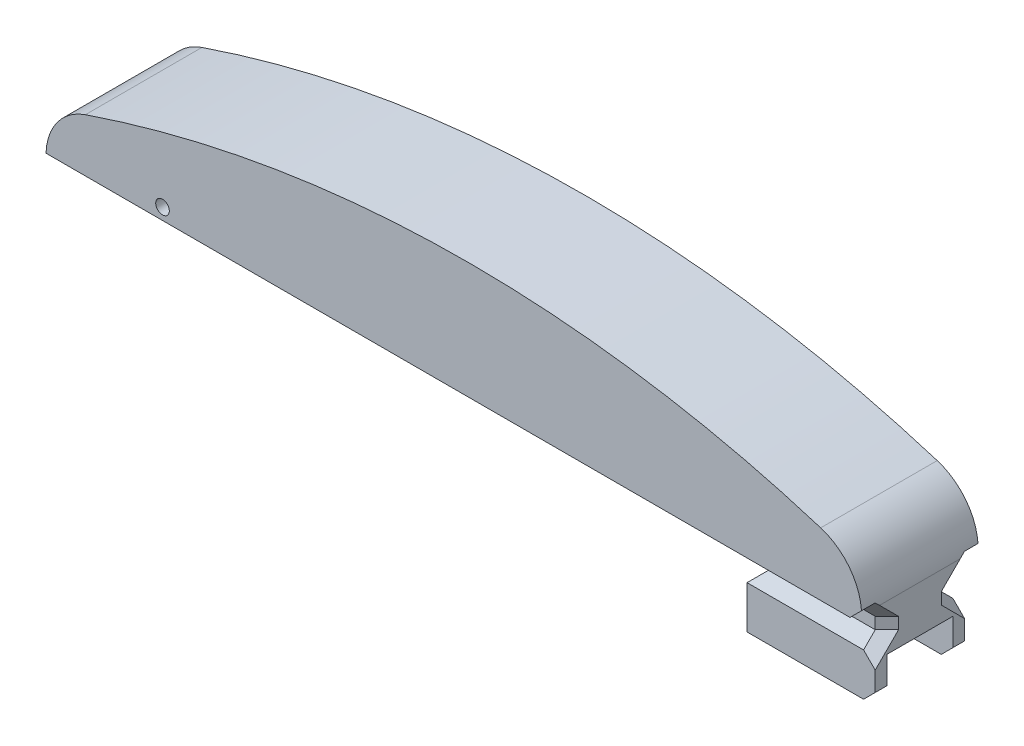
ISO-10303-21;
HEADER;
FILE_DESCRIPTION(('STEP AP214'),'2;1');
FILE_NAME('part.step','',(''),(''),'','','');
FILE_SCHEMA(('AUTOMOTIVE_DESIGN { 1 0 10303 214 1 1 1 1 }'));
ENDSEC;
DATA;
#1=APPLICATION_CONTEXT('core data for automotive mechanical design processes');
#2=APPLICATION_PROTOCOL_DEFINITION('international standard','automotive_design',2000,#1);
#3=PRODUCT_CONTEXT('',#1,'mechanical');
#4=PRODUCT('Part','Part','',(#3));
#5=PRODUCT_RELATED_PRODUCT_CATEGORY('part','',(#4));
#6=PRODUCT_DEFINITION_FORMATION('','',#4);
#7=PRODUCT_DEFINITION_CONTEXT('part definition',#1,'design');
#8=PRODUCT_DEFINITION('design','',#6,#7);
#9=PRODUCT_DEFINITION_SHAPE('','',#8);
#10=(LENGTH_UNIT() NAMED_UNIT(*) SI_UNIT(.MILLI.,.METRE.));
#11=(NAMED_UNIT(*) PLANE_ANGLE_UNIT() SI_UNIT($,.RADIAN.));
#12=(NAMED_UNIT(*) SI_UNIT($,.STERADIAN.) SOLID_ANGLE_UNIT());
#13=UNCERTAINTY_MEASURE_WITH_UNIT(LENGTH_MEASURE(1.E-05),#10,'distance_accuracy_value','');
#14=(GEOMETRIC_REPRESENTATION_CONTEXT(3) GLOBAL_UNCERTAINTY_ASSIGNED_CONTEXT((#13)) GLOBAL_UNIT_ASSIGNED_CONTEXT((#10,
#11,#12)) REPRESENTATION_CONTEXT('',''));
#15=CARTESIAN_POINT('',(0.,0.,0.));
#16=DIRECTION('',(0.,0.,1.));
#17=DIRECTION('',(1.,0.,0.));
#18=AXIS2_PLACEMENT_3D('',#15,#16,#17);
#19=CARTESIAN_POINT('',(105.,0.,30.));
#20=DIRECTION('',(-1.,0.,0.));
#21=DIRECTION('',(0.,0.,1.));
#22=AXIS2_PLACEMENT_3D('',#19,#20,#21);
#23=PLANE('',#22);
#24=DIRECTION('',(0.,-0.707106781186551,0.707106781186544));
#25=VECTOR('',#24,1.);
#26=CARTESIAN_POINT('',(105.,-2.99999999999999,9.50000000000003));
#27=LINE('',#26,#25);
#28=CARTESIAN_POINT('',(105.,1.8830576413375,4.61694235866258));
#29=VERTEX_POINT('',#28);
#30=CARTESIAN_POINT('',(105.,0.,6.5));
#31=VERTEX_POINT('',#30);
#32=EDGE_CURVE('E328',#29,#31,#27,.T.);
#33=ORIENTED_EDGE('',*,*,#32,.F.);
#34=DIRECTION('',(0.,0.,-1.));
#35=VECTOR('',#34,1.);
#36=CARTESIAN_POINT('',(105.,1.8830576413375,30.));
#37=LINE('',#36,#35);
#38=CARTESIAN_POINT('',(105.,1.8830576413375,25.3830576413374));
#39=VERTEX_POINT('',#38);
#40=EDGE_CURVE('E62',#29,#39,#37,.F.);
#41=ORIENTED_EDGE('',*,*,#40,.T.);
#42=DIRECTION('',(0.,0.707106781186551,0.707106781186544));
#43=VECTOR('',#42,1.);
#44=CARTESIAN_POINT('',(105.,3.00000000000007,26.5));
#45=LINE('',#44,#43);
#46=CARTESIAN_POINT('',(105.,0.,23.5));
#47=VERTEX_POINT('',#46);
#48=EDGE_CURVE('E341',#47,#39,#45,.T.);
#49=ORIENTED_EDGE('',*,*,#48,.F.);
#50=DIRECTION('',(0.,0.707106781186551,0.707106781186544));
#51=VECTOR('',#50,1.);
#52=CARTESIAN_POINT('',(105.,3.00000000000007,26.5));
#53=LINE('',#52,#51);
#54=CARTESIAN_POINT('',(105.,-2.99999999999999,20.5));
#55=VERTEX_POINT('',#54);
#56=EDGE_CURVE('E343',#55,#47,#53,.T.);
#57=ORIENTED_EDGE('',*,*,#56,.F.);
#58=DIRECTION('',(0.,-1.,0.));
#59=VECTOR('',#58,1.);
#60=CARTESIAN_POINT('',(105.,0.,20.5));
#61=LINE('',#60,#59);
#62=CARTESIAN_POINT('',(105.,-5.99999999999995,20.5));
#63=VERTEX_POINT('',#62);
#64=EDGE_CURVE('E346',#55,#63,#61,.T.);
#65=ORIENTED_EDGE('',*,*,#64,.T.);
#66=DIRECTION('',(0.,0.707106781186551,-0.707106781186544));
#67=VECTOR('',#66,1.);
#68=CARTESIAN_POINT('',(105.,-5.99999999999995,20.5));
#69=LINE('',#68,#67);
#70=CARTESIAN_POINT('',(105.,-8.99999999999998,23.5));
#71=VERTEX_POINT('',#70);
#72=EDGE_CURVE('E348',#71,#63,#69,.T.);
#73=ORIENTED_EDGE('',*,*,#72,.F.);
#74=DIRECTION('',(0.,0.707106781186551,-0.707106781186544));
#75=VECTOR('',#74,1.);
#76=CARTESIAN_POINT('',(105.,-5.99999999999995,20.5));
#77=LINE('',#76,#75);
#78=CARTESIAN_POINT('',(105.,-12.,26.5));
#79=VERTEX_POINT('',#78);
#80=EDGE_CURVE('E351',#79,#71,#77,.T.);
#81=ORIENTED_EDGE('',*,*,#80,.F.);
#82=DIRECTION('',(0.,-1.,0.));
#83=VECTOR('',#82,1.);
#84=CARTESIAN_POINT('',(105.,-8.99999999999998,26.5));
#85=LINE('',#84,#83);
#86=CARTESIAN_POINT('',(105.,-17.,26.5));
#87=VERTEX_POINT('',#86);
#88=EDGE_CURVE('E267',#79,#87,#85,.T.);
#89=ORIENTED_EDGE('',*,*,#88,.T.);
#90=DIRECTION('',(0.,0.,-1.));
#91=VECTOR('',#90,1.);
#92=CARTESIAN_POINT('',(105.,-17.,23.5));
#93=LINE('',#92,#91);
#94=CARTESIAN_POINT('',(105.,-17.,23.5));
#95=VERTEX_POINT('',#94);
#96=EDGE_CURVE('E356',#87,#95,#93,.T.);
#97=ORIENTED_EDGE('',*,*,#96,.T.);
#98=DIRECTION('',(0.,-1.,0.));
#99=VECTOR('',#98,1.);
#100=CARTESIAN_POINT('',(105.,-8.99999999999998,23.5));
#101=LINE('',#100,#99);
#102=CARTESIAN_POINT('',(105.,-9.99999999999998,23.5));
#103=VERTEX_POINT('',#102);
#104=EDGE_CURVE('E271',#103,#95,#101,.T.);
#105=ORIENTED_EDGE('',*,*,#104,.F.);
#106=DIRECTION('',(0.,0.,1.));
#107=VECTOR('',#106,1.);
#108=CARTESIAN_POINT('',(105.,-9.99999999999998,15.));
#109=LINE('',#108,#107);
#110=CARTESIAN_POINT('',(105.,-9.99999999999998,6.5));
#111=VERTEX_POINT('',#110);
#112=EDGE_CURVE('E286',#111,#103,#109,.T.);
#113=ORIENTED_EDGE('',*,*,#112,.F.);
#114=DIRECTION('',(0.,-1.,0.));
#115=VECTOR('',#114,1.);
#116=CARTESIAN_POINT('',(105.,-8.99999999999998,6.5));
#117=LINE('',#116,#115);
#118=CARTESIAN_POINT('',(105.,-17.,6.5));
#119=VERTEX_POINT('',#118);
#120=EDGE_CURVE('E279',#111,#119,#117,.T.);
#121=ORIENTED_EDGE('',*,*,#120,.T.);
#122=DIRECTION('',(0.,0.,-1.));
#123=VECTOR('',#122,1.);
#124=CARTESIAN_POINT('',(105.,-17.,3.5));
#125=LINE('',#124,#123);
#126=CARTESIAN_POINT('',(105.,-17.,3.5));
#127=VERTEX_POINT('',#126);
#128=EDGE_CURVE('E354',#119,#127,#125,.T.);
#129=ORIENTED_EDGE('',*,*,#128,.T.);
#130=DIRECTION('',(0.,-1.,0.));
#131=VECTOR('',#130,1.);
#132=CARTESIAN_POINT('',(105.,-8.99999999999998,3.5));
#133=LINE('',#132,#131);
#134=CARTESIAN_POINT('',(105.,-12.,3.5));
#135=VERTEX_POINT('',#134);
#136=EDGE_CURVE('E282',#135,#127,#133,.T.);
#137=ORIENTED_EDGE('',*,*,#136,.F.);
#138=DIRECTION('',(0.,-0.707106781186551,-0.707106781186544));
#139=VECTOR('',#138,1.);
#140=CARTESIAN_POINT('',(105.,-12.,3.49999999999999));
#141=LINE('',#140,#139);
#142=CARTESIAN_POINT('',(105.,-8.99999999999998,6.5));
#143=VERTEX_POINT('',#142);
#144=EDGE_CURVE('E338',#143,#135,#141,.T.);
#145=ORIENTED_EDGE('',*,*,#144,.F.);
#146=DIRECTION('',(0.,-0.707106781186551,-0.707106781186544));
#147=VECTOR('',#146,1.);
#148=CARTESIAN_POINT('',(105.,-12.,3.49999999999999));
#149=LINE('',#148,#147);
#150=CARTESIAN_POINT('',(105.,-5.99999999999995,9.50000000000003));
#151=VERTEX_POINT('',#150);
#152=EDGE_CURVE('E335',#151,#143,#149,.T.);
#153=ORIENTED_EDGE('',*,*,#152,.F.);
#154=DIRECTION('',(0.,1.,0.));
#155=VECTOR('',#154,1.);
#156=CARTESIAN_POINT('',(105.,0.,9.50000000000003));
#157=LINE('',#156,#155);
#158=CARTESIAN_POINT('',(105.,-2.99999999999999,9.50000000000003));
#159=VERTEX_POINT('',#158);
#160=EDGE_CURVE('E333',#151,#159,#157,.T.);
#161=ORIENTED_EDGE('',*,*,#160,.T.);
#162=DIRECTION('',(0.,-0.707106781186551,0.707106781186544));
#163=VECTOR('',#162,1.);
#164=CARTESIAN_POINT('',(105.,-2.99999999999999,9.50000000000003));
#165=LINE('',#164,#163);
#166=EDGE_CURVE('E330',#31,#159,#165,.T.);
#167=ORIENTED_EDGE('',*,*,#166,.F.);
#168=EDGE_LOOP('',(#33,#41,#49,#57,#65,#73,#81,#89,#97,#105,#113,#121,#129,#137,#145,#153,#161,#167));
#169=FACE_BOUND('',#168,.T.);
#170=ADVANCED_FACE('F40',(#169),#23,.F.);
#171=CARTESIAN_POINT('',(105.,-9.99999999999998,23.5));
#172=DIRECTION('',(0.,0.,-1.));
#173=DIRECTION('',(-1.,0.,0.));
#174=AXIS2_PLACEMENT_3D('',#171,#172,#173);
#175=PLANE('',#174);
#176=DIRECTION('',(0.,1.,0.));
#177=VECTOR('',#176,1.);
#178=CARTESIAN_POINT('',(102.,-9.99999999999998,23.5));
#179=LINE('',#178,#177);
#180=CARTESIAN_POINT('',(102.,-5.99999999999995,23.5));
#181=VERTEX_POINT('',#180);
#182=CARTESIAN_POINT('',(102.,-2.99999999999999,23.5));
#183=VERTEX_POINT('',#182);
#184=EDGE_CURVE('E368',#181,#183,#179,.T.);
#185=ORIENTED_EDGE('',*,*,#184,.T.);
#186=DIRECTION('',(-1.,0.,0.));
#187=VECTOR('',#186,1.);
#188=CARTESIAN_POINT('',(75.,-3.,23.5));
#189=LINE('',#188,#187);
#190=CARTESIAN_POINT('',(75.,-3.,23.5));
#191=VERTEX_POINT('',#190);
#192=EDGE_CURVE('E370',#183,#191,#189,.T.);
#193=ORIENTED_EDGE('',*,*,#192,.T.);
#194=DIRECTION('',(0.,1.,0.));
#195=VECTOR('',#194,1.);
#196=CARTESIAN_POINT('',(75.,-9.99999999999999,23.5));
#197=LINE('',#196,#195);
#198=CARTESIAN_POINT('',(75.,-5.99999999999995,23.5));
#199=VERTEX_POINT('',#198);
#200=EDGE_CURVE('E302',#199,#191,#197,.T.);
#201=ORIENTED_EDGE('',*,*,#200,.F.);
#202=DIRECTION('',(1.,0.,0.));
#203=VECTOR('',#202,1.);
#204=CARTESIAN_POINT('',(105.,-5.99999999999995,23.5));
#205=LINE('',#204,#203);
#206=EDGE_CURVE('E366',#199,#181,#205,.T.);
#207=ORIENTED_EDGE('',*,*,#206,.T.);
#208=EDGE_LOOP('',(#185,#193,#201,#207));
#209=FACE_BOUND('',#208,.T.);
#210=ADVANCED_FACE('F514',(#209),#175,.F.);
#211=CARTESIAN_POINT('',(75.,-9.99999999999999,23.5));
#212=DIRECTION('',(1.,0.,0.));
#213=DIRECTION('',(0.,1.,0.));
#214=AXIS2_PLACEMENT_3D('',#211,#212,#213);
#215=PLANE('',#214);
#216=DIRECTION('',(0.,1.,0.));
#217=VECTOR('',#216,1.);
#218=CARTESIAN_POINT('',(75.,-9.99999999999999,6.5));
#219=LINE('',#218,#217);
#220=CARTESIAN_POINT('',(75.,-5.99999999999996,6.5));
#221=VERTEX_POINT('',#220);
#222=CARTESIAN_POINT('',(75.,-3.,6.5));
#223=VERTEX_POINT('',#222);
#224=EDGE_CURVE('E298',#221,#223,#219,.T.);
#225=ORIENTED_EDGE('',*,*,#224,.F.);
#226=DIRECTION('',(0.,0.,1.));
#227=VECTOR('',#226,1.);
#228=CARTESIAN_POINT('',(75.,-5.99999999999996,23.5));
#229=LINE('',#228,#227);
#230=EDGE_CURVE('E393',#221,#199,#229,.T.);
#231=ORIENTED_EDGE('',*,*,#230,.T.);
#232=ORIENTED_EDGE('',*,*,#200,.T.);
#233=DIRECTION('',(0.,-0.707106781186551,-0.707106781186544));
#234=VECTOR('',#233,1.);
#235=CARTESIAN_POINT('',(75.,-6.50000000000003,20.));
#236=LINE('',#235,#234);
#237=CARTESIAN_POINT('',(75.,0.,26.5));
#238=VERTEX_POINT('',#237);
#239=EDGE_CURVE('E395',#191,#238,#236,.F.);
#240=ORIENTED_EDGE('',*,*,#239,.T.);
#241=DIRECTION('',(0.,0.,-1.));
#242=VECTOR('',#241,1.);
#243=CARTESIAN_POINT('',(75.,0.,23.5));
#244=LINE('',#243,#242);
#245=CARTESIAN_POINT('',(75.,0.,3.5));
#246=VERTEX_POINT('',#245);
#247=EDGE_CURVE('E270',#238,#246,#244,.T.);
#248=ORIENTED_EDGE('',*,*,#247,.T.);
#249=DIRECTION('',(0.,0.707106781186551,-0.707106781186544));
#250=VECTOR('',#249,1.);
#251=CARTESIAN_POINT('',(75.,-15.,18.4999999999999));
#252=LINE('',#251,#250);
#253=EDGE_CURVE('E398',#246,#223,#252,.F.);
#254=ORIENTED_EDGE('',*,*,#253,.T.);
#255=EDGE_LOOP('',(#225,#231,#232,#240,#248,#254));
#256=FACE_BOUND('',#255,.T.);
#257=ADVANCED_FACE('F495',(#256),#215,.F.);
#258=CARTESIAN_POINT('',(75.,-9.99999999999999,6.5));
#259=DIRECTION('',(0.,0.,1.));
#260=DIRECTION('',(1.,0.,0.));
#261=AXIS2_PLACEMENT_3D('',#258,#259,#260);
#262=PLANE('',#261);
#263=ORIENTED_EDGE('',*,*,#224,.T.);
#264=DIRECTION('',(1.,0.,0.));
#265=VECTOR('',#264,1.);
#266=CARTESIAN_POINT('',(105.,-2.99999999999999,6.5));
#267=LINE('',#266,#265);
#268=CARTESIAN_POINT('',(102.,-2.99999999999999,6.5));
#269=VERTEX_POINT('',#268);
#270=EDGE_CURVE('E389',#223,#269,#267,.T.);
#271=ORIENTED_EDGE('',*,*,#270,.T.);
#272=DIRECTION('',(0.,-1.,0.));
#273=VECTOR('',#272,1.);
#274=CARTESIAN_POINT('',(102.,-9.99999999999999,6.5));
#275=LINE('',#274,#273);
#276=CARTESIAN_POINT('',(102.,-5.99999999999995,6.5));
#277=VERTEX_POINT('',#276);
#278=EDGE_CURVE('E387',#269,#277,#275,.T.);
#279=ORIENTED_EDGE('',*,*,#278,.T.);
#280=DIRECTION('',(-1.,0.,0.));
#281=VECTOR('',#280,1.);
#282=CARTESIAN_POINT('',(75.,-5.99999999999995,6.5));
#283=LINE('',#282,#281);
#284=EDGE_CURVE('E385',#277,#221,#283,.T.);
#285=ORIENTED_EDGE('',*,*,#284,.T.);
#286=EDGE_LOOP('',(#263,#271,#279,#285));
#287=FACE_BOUND('',#286,.T.);
#288=ADVANCED_FACE('F498',(#287),#262,.F.);
#289=CARTESIAN_POINT('',(-105.,0.,30.));
#290=DIRECTION('',(0.,1.,0.));
#291=DIRECTION('',(-1.,0.,0.));
#292=AXIS2_PLACEMENT_3D('',#289,#290,#291);
#293=PLANE('',#292);
#294=DIRECTION('',(1.,0.,0.));
#295=VECTOR('',#294,1.);
#296=CARTESIAN_POINT('',(105.,0.,26.5));
#297=LINE('',#296,#295);
#298=CARTESIAN_POINT('',(102.,0.,26.5));
#299=VERTEX_POINT('',#298);
#300=EDGE_CURVE('E377',#238,#299,#297,.T.);
#301=ORIENTED_EDGE('',*,*,#300,.T.);
#302=DIRECTION('',(0.,0.,1.));
#303=VECTOR('',#302,1.);
#304=CARTESIAN_POINT('',(102.,0.,30.));
#305=LINE('',#304,#303);
#306=CARTESIAN_POINT('',(102.,0.,30.));
#307=VERTEX_POINT('',#306);
#308=EDGE_CURVE('E380',#299,#307,#305,.T.);
#309=ORIENTED_EDGE('',*,*,#308,.T.);
#310=DIRECTION('',(1.,0.,0.));
#311=VECTOR('',#310,1.);
#312=CARTESIAN_POINT('',(-105.,0.,30.));
#313=LINE('',#312,#311);
#314=CARTESIAN_POINT('',(-105.,0.,30.));
#315=VERTEX_POINT('',#314);
#316=EDGE_CURVE('E309',#315,#307,#313,.T.);
#317=ORIENTED_EDGE('',*,*,#316,.F.);
#318=DIRECTION('',(0.,0.,-1.));
#319=VECTOR('',#318,1.);
#320=CARTESIAN_POINT('',(-105.,0.,30.));
#321=LINE('',#320,#319);
#322=CARTESIAN_POINT('',(-105.,0.,0.));
#323=VERTEX_POINT('',#322);
#324=EDGE_CURVE('E313',#315,#323,#321,.T.);
#325=ORIENTED_EDGE('',*,*,#324,.T.);
#326=DIRECTION('',(1.,0.,0.));
#327=VECTOR('',#326,1.);
#328=CARTESIAN_POINT('',(-105.,0.,0.));
#329=LINE('',#328,#327);
#330=CARTESIAN_POINT('',(102.,0.,0.));
#331=VERTEX_POINT('',#330);
#332=EDGE_CURVE('E310',#323,#331,#329,.T.);
#333=ORIENTED_EDGE('',*,*,#332,.T.);
#334=DIRECTION('',(0.,0.,1.));
#335=VECTOR('',#334,1.);
#336=CARTESIAN_POINT('',(102.,0.,30.));
#337=LINE('',#336,#335);
#338=CARTESIAN_POINT('',(102.,0.,3.5));
#339=VERTEX_POINT('',#338);
#340=EDGE_CURVE('E375',#331,#339,#337,.T.);
#341=ORIENTED_EDGE('',*,*,#340,.T.);
#342=DIRECTION('',(-1.,0.,0.));
#343=VECTOR('',#342,1.);
#344=CARTESIAN_POINT('',(75.,0.,3.5));
#345=LINE('',#344,#343);
#346=EDGE_CURVE('E372',#339,#246,#345,.T.);
#347=ORIENTED_EDGE('',*,*,#346,.T.);
#348=ORIENTED_EDGE('',*,*,#247,.F.);
#349=EDGE_LOOP('',(#301,#309,#317,#325,#333,#341,#347,#348));
#350=FACE_BOUND('',#349,.T.);
#351=ADVANCED_FACE('F472',(#350),#293,.F.);
#352=CARTESIAN_POINT('',(3.69070116823667,-274.955381006037,30.));
#353=DIRECTION('',(0.,0.,-1.));
#354=DIRECTION('',(-1.,0.,0.));
#355=AXIS2_PLACEMENT_3D('',#352,#353,#354);
#356=CYLINDRICAL_SURFACE('',#355,304.980716906395);
#357=CARTESIAN_POINT('',(3.69070116823667,-274.955381006037,0.));
#358=DIRECTION('',(0.,0.,1.));
#359=DIRECTION('',(1.,0.,0.));
#360=AXIS2_PLACEMENT_3D('',#357,#358,#359);
#361=CIRCLE('',#360,304.980716906395);
#362=CARTESIAN_POINT('',(94.4645709421236,16.2032394244975,0.));
#363=VERTEX_POINT('',#362);
#364=CARTESIAN_POINT('',(-94.8562558416738,13.6650183922479,0.));
#365=VERTEX_POINT('',#364);
#366=EDGE_CURVE('E305',#363,#365,#361,.T.);
#367=ORIENTED_EDGE('',*,*,#366,.T.);
#368=DIRECTION('',(0.,0.,-1.));
#369=VECTOR('',#368,1.);
#370=CARTESIAN_POINT('',(-94.8562558416739,13.6650183922479,30.));
#371=LINE('',#370,#369);
#372=CARTESIAN_POINT('',(-94.8562558416738,13.6650183922479,30.));
#373=VERTEX_POINT('',#372);
#374=EDGE_CURVE('E441',#365,#373,#371,.F.);
#375=ORIENTED_EDGE('',*,*,#374,.T.);
#376=CARTESIAN_POINT('',(3.69070116823667,-274.955381006037,30.));
#377=DIRECTION('',(0.,0.,1.));
#378=DIRECTION('',(1.,0.,0.));
#379=AXIS2_PLACEMENT_3D('',#376,#377,#378);
#380=CIRCLE('',#379,304.980716906395);
#381=CARTESIAN_POINT('',(94.4645709421236,16.2032394244975,30.));
#382=VERTEX_POINT('',#381);
#383=EDGE_CURVE('E306',#382,#373,#380,.T.);
#384=ORIENTED_EDGE('',*,*,#383,.F.);
#385=DIRECTION('',(0.,0.,-1.));
#386=VECTOR('',#385,1.);
#387=CARTESIAN_POINT('',(94.4645709421236,16.2032394244975,30.));
#388=LINE('',#387,#386);
#389=EDGE_CURVE('E438',#382,#363,#388,.T.);
#390=ORIENTED_EDGE('',*,*,#389,.T.);
#391=EDGE_LOOP('',(#367,#375,#384,#390));
#392=FACE_BOUND('',#391,.T.);
#393=ADVANCED_FACE('F481',(#392),#356,.T.);
#394=CARTESIAN_POINT('',(3.69070116823667,-274.955381006037,30.));
#395=DIRECTION('',(0.,0.,1.));
#396=DIRECTION('',(1.,0.,0.));
#397=AXIS2_PLACEMENT_3D('',#394,#395,#396);
#398=PLANE('',#397);
#399=CARTESIAN_POINT('',(-75.,3.,30.));
#400=DIRECTION('',(0.,0.,1.));
#401=DIRECTION('',(1.,0.,0.));
#402=AXIS2_PLACEMENT_3D('',#399,#400,#401);
#403=CIRCLE('',#402,1.75);
#404=CARTESIAN_POINT('',(-73.25,3.,30.));
#405=VERTEX_POINT('',#404);
#406=EDGE_CURVE('E899',#405,#405,#403,.T.);
#407=ORIENTED_EDGE('',*,*,#406,.F.);
#408=EDGE_LOOP('',(#407));
#409=FACE_BOUND('',#408,.T.);
#410=ORIENTED_EDGE('',*,*,#383,.T.);
#411=CARTESIAN_POINT('',(-90.009377750026,-0.530324955649891,30.));
#412=DIRECTION('',(0.,0.,1.));
#413=DIRECTION('',(1.,0.,0.));
#414=AXIS2_PLACEMENT_3D('',#411,#412,#413);
#415=CIRCLE('',#414,15.);
#416=EDGE_CURVE('E445',#373,#315,#415,.T.);
#417=ORIENTED_EDGE('',*,*,#416,.T.);
#418=ORIENTED_EDGE('',*,*,#316,.T.);
#419=DIRECTION('',(-0.707106781186544,-0.707106781186551,0.));
#420=VECTOR('',#419,1.);
#421=CARTESIAN_POINT('',(-84.6323399189,-186.632339918902,30.));
#422=LINE('',#421,#420);
#423=CARTESIAN_POINT('',(104.961203230009,2.96120323000895,30.));
#424=VERTEX_POINT('',#423);
#425=EDGE_CURVE('E382',#307,#424,#422,.F.);
#426=ORIENTED_EDGE('',*,*,#425,.T.);
#427=CARTESIAN_POINT('',(90.,1.8830576413375,30.));
#428=DIRECTION('',(0.,0.,1.));
#429=DIRECTION('',(1.,0.,0.));
#430=AXIS2_PLACEMENT_3D('',#427,#428,#429);
#431=CIRCLE('',#430,15.);
#432=EDGE_CURVE('E443',#424,#382,#431,.T.);
#433=ORIENTED_EDGE('',*,*,#432,.T.);
#434=EDGE_LOOP('',(#410,#417,#418,#426,#433));
#435=FACE_BOUND('',#434,.T.);
#436=ADVANCED_FACE('F466',(#409,#435),#398,.T.);
#437=CARTESIAN_POINT('',(3.69070116823667,-274.955381006037,0.));
#438=DIRECTION('',(0.,0.,1.));
#439=DIRECTION('',(1.,0.,0.));
#440=AXIS2_PLACEMENT_3D('',#437,#438,#439);
#441=PLANE('',#440);
#442=CARTESIAN_POINT('',(-75.,3.,0.));
#443=DIRECTION('',(0.,0.,1.));
#444=DIRECTION('',(1.,0.,0.));
#445=AXIS2_PLACEMENT_3D('',#442,#443,#444);
#446=CIRCLE('',#445,1.75);
#447=CARTESIAN_POINT('',(-73.25,3.,0.));
#448=VERTEX_POINT('',#447);
#449=EDGE_CURVE('E405',#448,#448,#446,.T.);
#450=ORIENTED_EDGE('',*,*,#449,.T.);
#451=EDGE_LOOP('',(#450));
#452=FACE_BOUND('',#451,.T.);
#453=ORIENTED_EDGE('',*,*,#332,.F.);
#454=CARTESIAN_POINT('',(-90.009377750026,-0.530324955649891,0.));
#455=DIRECTION('',(0.,0.,1.));
#456=DIRECTION('',(1.,0.,0.));
#457=AXIS2_PLACEMENT_3D('',#454,#455,#456);
#458=CIRCLE('',#457,15.);
#459=EDGE_CURVE('E436',#323,#365,#458,.F.);
#460=ORIENTED_EDGE('',*,*,#459,.T.);
#461=ORIENTED_EDGE('',*,*,#366,.F.);
#462=CARTESIAN_POINT('',(90.,1.8830576413375,0.));
#463=DIRECTION('',(0.,0.,1.));
#464=DIRECTION('',(1.,0.,0.));
#465=AXIS2_PLACEMENT_3D('',#462,#463,#464);
#466=CIRCLE('',#465,15.);
#467=CARTESIAN_POINT('',(104.961203230009,2.96120323000895,0.));
#468=VERTEX_POINT('',#467);
#469=EDGE_CURVE('E400',#363,#468,#466,.F.);
#470=ORIENTED_EDGE('',*,*,#469,.T.);
#471=DIRECTION('',(0.707106781186544,0.707106781186551,0.));
#472=VECTOR('',#471,1.);
#473=CARTESIAN_POINT('',(105.,3.00000000000007,0.));
#474=LINE('',#473,#472);
#475=EDGE_CURVE('E391',#468,#331,#474,.F.);
#476=ORIENTED_EDGE('',*,*,#475,.T.);
#477=EDGE_LOOP('',(#453,#460,#461,#470,#476));
#478=FACE_BOUND('',#477,.T.);
#479=ADVANCED_FACE('F479',(#452,#478),#441,.F.);
#480=CARTESIAN_POINT('',(0.,-10.,0.));
#481=DIRECTION('',(0.,-1.,0.));
#482=DIRECTION('',(1.,0.,0.));
#483=AXIS2_PLACEMENT_3D('',#480,#481,#482);
#484=PLANE('',#483);
#485=ORIENTED_EDGE('',*,*,#112,.T.);
#486=DIRECTION('',(-1.,0.,0.));
#487=VECTOR('',#486,1.);
#488=CARTESIAN_POINT('',(105.,-9.99999999999998,23.5));
#489=LINE('',#488,#487);
#490=CARTESIAN_POINT('',(75.,-9.99999999999999,23.5));
#491=VERTEX_POINT('',#490);
#492=EDGE_CURVE('E289',#103,#491,#489,.T.);
#493=ORIENTED_EDGE('',*,*,#492,.T.);
#494=DIRECTION('',(0.,0.,-1.));
#495=VECTOR('',#494,1.);
#496=CARTESIAN_POINT('',(75.,-9.99999999999999,23.5));
#497=LINE('',#496,#495);
#498=CARTESIAN_POINT('',(75.,-9.99999999999998,6.5));
#499=VERTEX_POINT('',#498);
#500=EDGE_CURVE('E292',#491,#499,#497,.T.);
#501=ORIENTED_EDGE('',*,*,#500,.T.);
#502=DIRECTION('',(1.,0.,0.));
#503=VECTOR('',#502,1.);
#504=CARTESIAN_POINT('',(75.,-9.99999999999999,6.5));
#505=LINE('',#504,#503);
#506=EDGE_CURVE('E295',#499,#111,#505,.T.);
#507=ORIENTED_EDGE('',*,*,#506,.T.);
#508=EDGE_LOOP('',(#485,#493,#501,#507));
#509=FACE_BOUND('',#508,.T.);
#510=ADVANCED_FACE('F547',(#509),#484,.T.);
#511=CARTESIAN_POINT('',(105.,-8.99999999999998,26.5));
#512=DIRECTION('',(0.,0.,1.));
#513=DIRECTION('',(1.,0.,0.));
#514=AXIS2_PLACEMENT_3D('',#511,#512,#513);
#515=PLANE('',#514);
#516=DIRECTION('',(-1.,0.,0.));
#517=VECTOR('',#516,1.);
#518=CARTESIAN_POINT('',(105.,-20.,26.5));
#519=LINE('',#518,#517);
#520=CARTESIAN_POINT('',(102.,-20.,26.5));
#521=VERTEX_POINT('',#520);
#522=CARTESIAN_POINT('',(72.,-20.,26.5));
#523=VERTEX_POINT('',#522);
#524=EDGE_CURVE('E225',#521,#523,#519,.T.);
#525=ORIENTED_EDGE('',*,*,#524,.F.);
#526=DIRECTION('',(0.707106781186544,0.707106781186551,0.));
#527=VECTOR('',#526,1.);
#528=CARTESIAN_POINT('',(109.,-13.,26.5));
#529=LINE('',#528,#527);
#530=EDGE_CURVE('E326',#521,#87,#529,.T.);
#531=ORIENTED_EDGE('',*,*,#530,.T.);
#532=ORIENTED_EDGE('',*,*,#88,.F.);
#533=DIRECTION('',(0.707106781186544,-0.707106781186551,0.));
#534=VECTOR('',#533,1.);
#535=CARTESIAN_POINT('',(103.5,-10.5,26.5));
#536=LINE('',#535,#534);
#537=CARTESIAN_POINT('',(102.,-8.99999999999998,26.5));
#538=VERTEX_POINT('',#537);
#539=EDGE_CURVE('E324',#79,#538,#536,.F.);
#540=ORIENTED_EDGE('',*,*,#539,.T.);
#541=DIRECTION('',(-1.,0.,0.));
#542=VECTOR('',#541,1.);
#543=CARTESIAN_POINT('',(105.,-8.99999999999998,26.5));
#544=LINE('',#543,#542);
#545=CARTESIAN_POINT('',(72.,-8.99999999999999,26.5));
#546=VERTEX_POINT('',#545);
#547=EDGE_CURVE('E243',#538,#546,#544,.T.);
#548=ORIENTED_EDGE('',*,*,#547,.T.);
#549=DIRECTION('',(0.,-1.,0.));
#550=VECTOR('',#549,1.);
#551=CARTESIAN_POINT('',(72.,-8.99999999999999,26.5));
#552=LINE('',#551,#550);
#553=EDGE_CURVE('E239',#546,#523,#552,.T.);
#554=ORIENTED_EDGE('',*,*,#553,.T.);
#555=EDGE_LOOP('',(#525,#531,#532,#540,#548,#554));
#556=FACE_BOUND('',#555,.T.);
#557=ADVANCED_FACE('F240',(#556),#515,.T.);
#558=CARTESIAN_POINT('',(105.,-8.99999999999998,23.5));
#559=DIRECTION('',(0.,0.,-1.));
#560=DIRECTION('',(-1.,0.,0.));
#561=AXIS2_PLACEMENT_3D('',#558,#559,#560);
#562=PLANE('',#561);
#563=ORIENTED_EDGE('',*,*,#104,.T.);
#564=DIRECTION('',(-0.707106781186544,-0.707106781186551,0.));
#565=VECTOR('',#564,1.);
#566=CARTESIAN_POINT('',(109.,-13.,23.5));
#567=LINE('',#566,#565);
#568=CARTESIAN_POINT('',(102.,-20.,23.5));
#569=VERTEX_POINT('',#568);
#570=EDGE_CURVE('E358',#95,#569,#567,.T.);
#571=ORIENTED_EDGE('',*,*,#570,.T.);
#572=DIRECTION('',(1.,0.,0.));
#573=VECTOR('',#572,1.);
#574=CARTESIAN_POINT('',(105.,-20.,23.5));
#575=LINE('',#574,#573);
#576=CARTESIAN_POINT('',(75.,-20.,23.5));
#577=VERTEX_POINT('',#576);
#578=EDGE_CURVE('E261',#577,#569,#575,.T.);
#579=ORIENTED_EDGE('',*,*,#578,.F.);
#580=DIRECTION('',(0.,-1.,0.));
#581=VECTOR('',#580,1.);
#582=CARTESIAN_POINT('',(75.,-8.99999999999999,23.5));
#583=LINE('',#582,#581);
#584=EDGE_CURVE('E274',#491,#577,#583,.T.);
#585=ORIENTED_EDGE('',*,*,#584,.F.);
#586=ORIENTED_EDGE('',*,*,#492,.F.);
#587=EDGE_LOOP('',(#563,#571,#579,#585,#586));
#588=FACE_BOUND('',#587,.T.);
#589=ADVANCED_FACE('F539',(#588),#562,.T.);
#590=CARTESIAN_POINT('',(75.,-8.99999999999999,23.5));
#591=DIRECTION('',(1.,0.,0.));
#592=DIRECTION('',(0.,1.,0.));
#593=AXIS2_PLACEMENT_3D('',#590,#591,#592);
#594=PLANE('',#593);
#595=DIRECTION('',(0.,-1.,0.));
#596=VECTOR('',#595,1.);
#597=CARTESIAN_POINT('',(75.,-8.99999999999999,6.5));
#598=LINE('',#597,#596);
#599=CARTESIAN_POINT('',(75.,-20.,6.5));
#600=VERTEX_POINT('',#599);
#601=EDGE_CURVE('E276',#499,#600,#598,.T.);
#602=ORIENTED_EDGE('',*,*,#601,.F.);
#603=ORIENTED_EDGE('',*,*,#500,.F.);
#604=ORIENTED_EDGE('',*,*,#584,.T.);
#605=DIRECTION('',(0.,0.,1.));
#606=VECTOR('',#605,1.);
#607=CARTESIAN_POINT('',(75.,-20.,23.5));
#608=LINE('',#607,#606);
#609=EDGE_CURVE('E258',#600,#577,#608,.T.);
#610=ORIENTED_EDGE('',*,*,#609,.F.);
#611=EDGE_LOOP('',(#602,#603,#604,#610));
#612=FACE_BOUND('',#611,.T.);
#613=ADVANCED_FACE('F545',(#612),#594,.T.);
#614=CARTESIAN_POINT('',(75.,-8.99999999999999,6.5));
#615=DIRECTION('',(0.,0.,1.));
#616=DIRECTION('',(1.,0.,0.));
#617=AXIS2_PLACEMENT_3D('',#614,#615,#616);
#618=PLANE('',#617);
#619=DIRECTION('',(-1.,0.,0.));
#620=VECTOR('',#619,1.);
#621=CARTESIAN_POINT('',(75.,-20.,6.5));
#622=LINE('',#621,#620);
#623=CARTESIAN_POINT('',(102.,-20.,6.5));
#624=VERTEX_POINT('',#623);
#625=EDGE_CURVE('E253',#624,#600,#622,.T.);
#626=ORIENTED_EDGE('',*,*,#625,.F.);
#627=DIRECTION('',(0.707106781186544,0.707106781186551,0.));
#628=VECTOR('',#627,1.);
#629=CARTESIAN_POINT('',(94.0000000000001,-28.,6.5));
#630=LINE('',#629,#628);
#631=EDGE_CURVE('E360',#624,#119,#630,.T.);
#632=ORIENTED_EDGE('',*,*,#631,.T.);
#633=ORIENTED_EDGE('',*,*,#120,.F.);
#634=ORIENTED_EDGE('',*,*,#506,.F.);
#635=ORIENTED_EDGE('',*,*,#601,.T.);
#636=EDGE_LOOP('',(#626,#632,#633,#634,#635));
#637=FACE_BOUND('',#636,.T.);
#638=ADVANCED_FACE('F558',(#637),#618,.T.);
#639=CARTESIAN_POINT('',(72.,-8.99999999999999,3.5));
#640=DIRECTION('',(0.,0.,-1.));
#641=DIRECTION('',(-1.,0.,0.));
#642=AXIS2_PLACEMENT_3D('',#639,#640,#641);
#643=PLANE('',#642);
#644=ORIENTED_EDGE('',*,*,#136,.T.);
#645=DIRECTION('',(-0.707106781186544,-0.707106781186551,0.));
#646=VECTOR('',#645,1.);
#647=CARTESIAN_POINT('',(92.5000000000002,-29.5,3.5));
#648=LINE('',#647,#646);
#649=CARTESIAN_POINT('',(102.,-20.,3.5));
#650=VERTEX_POINT('',#649);
#651=EDGE_CURVE('E364',#127,#650,#648,.T.);
#652=ORIENTED_EDGE('',*,*,#651,.T.);
#653=DIRECTION('',(1.,0.,0.));
#654=VECTOR('',#653,1.);
#655=CARTESIAN_POINT('',(72.,-20.,3.5));
#656=LINE('',#655,#654);
#657=CARTESIAN_POINT('',(72.,-20.,3.5));
#658=VERTEX_POINT('',#657);
#659=EDGE_CURVE('E251',#658,#650,#656,.T.);
#660=ORIENTED_EDGE('',*,*,#659,.F.);
#661=DIRECTION('',(0.,-1.,0.));
#662=VECTOR('',#661,1.);
#663=CARTESIAN_POINT('',(72.,-8.99999999999999,3.5));
#664=LINE('',#663,#662);
#665=CARTESIAN_POINT('',(72.,-8.99999999999999,3.5));
#666=VERTEX_POINT('',#665);
#667=EDGE_CURVE('E247',#666,#658,#664,.T.);
#668=ORIENTED_EDGE('',*,*,#667,.F.);
#669=DIRECTION('',(1.,0.,0.));
#670=VECTOR('',#669,1.);
#671=CARTESIAN_POINT('',(72.,-8.99999999999999,3.5));
#672=LINE('',#671,#670);
#673=CARTESIAN_POINT('',(102.,-8.99999999999998,3.5));
#674=VERTEX_POINT('',#673);
#675=EDGE_CURVE('E248',#666,#674,#672,.T.);
#676=ORIENTED_EDGE('',*,*,#675,.T.);
#677=DIRECTION('',(-0.707106781186544,0.707106781186551,0.));
#678=VECTOR('',#677,1.);
#679=CARTESIAN_POINT('',(87.0000000000001,6.00000000000002,3.5));
#680=LINE('',#679,#678);
#681=EDGE_CURVE('E362',#674,#135,#680,.F.);
#682=ORIENTED_EDGE('',*,*,#681,.T.);
#683=EDGE_LOOP('',(#644,#652,#660,#668,#676,#682));
#684=FACE_BOUND('',#683,.T.);
#685=ADVANCED_FACE('F557',(#684),#643,.T.);
#686=CARTESIAN_POINT('',(72.,-8.99999999999999,26.5));
#687=DIRECTION('',(-1.,0.,0.));
#688=DIRECTION('',(0.,-1.,0.));
#689=AXIS2_PLACEMENT_3D('',#686,#687,#688);
#690=PLANE('',#689);
#691=ORIENTED_EDGE('',*,*,#667,.T.);
#692=DIRECTION('',(0.,0.,-1.));
#693=VECTOR('',#692,1.);
#694=CARTESIAN_POINT('',(72.,-20.,26.5));
#695=LINE('',#694,#693);
#696=EDGE_CURVE('E231',#523,#658,#695,.T.);
#697=ORIENTED_EDGE('',*,*,#696,.F.);
#698=ORIENTED_EDGE('',*,*,#553,.F.);
#699=DIRECTION('',(0.,0.,-1.));
#700=VECTOR('',#699,1.);
#701=CARTESIAN_POINT('',(72.,-8.99999999999999,26.5));
#702=LINE('',#701,#700);
#703=EDGE_CURVE('E264',#546,#666,#702,.T.);
#704=ORIENTED_EDGE('',*,*,#703,.T.);
#705=EDGE_LOOP('',(#691,#697,#698,#704));
#706=FACE_BOUND('',#705,.T.);
#707=ADVANCED_FACE('F250',(#706),#690,.T.);
#708=CARTESIAN_POINT('',(0.,-20.,0.));
#709=DIRECTION('',(0.,-1.,0.));
#710=DIRECTION('',(1.,0.,0.));
#711=AXIS2_PLACEMENT_3D('',#708,#709,#710);
#712=PLANE('',#711);
#713=ORIENTED_EDGE('',*,*,#578,.T.);
#714=DIRECTION('',(0.,0.,1.));
#715=VECTOR('',#714,1.);
#716=CARTESIAN_POINT('',(102.,-20.,26.5));
#717=LINE('',#716,#715);
#718=EDGE_CURVE('E234',#569,#521,#717,.T.);
#719=ORIENTED_EDGE('',*,*,#718,.T.);
#720=ORIENTED_EDGE('',*,*,#524,.T.);
#721=ORIENTED_EDGE('',*,*,#696,.T.);
#722=ORIENTED_EDGE('',*,*,#659,.T.);
#723=DIRECTION('',(0.,0.,1.));
#724=VECTOR('',#723,1.);
#725=CARTESIAN_POINT('',(102.,-20.,6.5));
#726=LINE('',#725,#724);
#727=EDGE_CURVE('E320',#650,#624,#726,.T.);
#728=ORIENTED_EDGE('',*,*,#727,.T.);
#729=ORIENTED_EDGE('',*,*,#625,.T.);
#730=ORIENTED_EDGE('',*,*,#609,.T.);
#731=EDGE_LOOP('',(#713,#719,#720,#721,#722,#728,#729,#730));
#732=FACE_BOUND('',#731,.T.);
#733=ADVANCED_FACE('F228',(#732),#712,.T.);
#734=CARTESIAN_POINT('',(102.,-20.,0.));
#735=DIRECTION('',(0.707106781186551,-0.707106781186544,0.));
#736=DIRECTION('',(0.,0.,-1.));
#737=AXIS2_PLACEMENT_3D('',#734,#735,#736);
#738=PLANE('',#737);
#739=ORIENTED_EDGE('',*,*,#570,.F.);
#740=ORIENTED_EDGE('',*,*,#96,.F.);
#741=ORIENTED_EDGE('',*,*,#530,.F.);
#742=ORIENTED_EDGE('',*,*,#718,.F.);
#743=EDGE_LOOP('',(#739,#740,#741,#742));
#744=FACE_BOUND('',#743,.T.);
#745=ADVANCED_FACE('F536',(#744),#738,.T.);
#746=CARTESIAN_POINT('',(102.,-20.,0.));
#747=DIRECTION('',(0.707106781186551,-0.707106781186544,0.));
#748=DIRECTION('',(0.,0.,-1.));
#749=AXIS2_PLACEMENT_3D('',#746,#747,#748);
#750=PLANE('',#749);
#751=ORIENTED_EDGE('',*,*,#651,.F.);
#752=ORIENTED_EDGE('',*,*,#128,.F.);
#753=ORIENTED_EDGE('',*,*,#631,.F.);
#754=ORIENTED_EDGE('',*,*,#727,.F.);
#755=EDGE_LOOP('',(#751,#752,#753,#754));
#756=FACE_BOUND('',#755,.T.);
#757=ADVANCED_FACE('F554',(#756),#750,.T.);
#758=CARTESIAN_POINT('',(105.,3.00000000000007,30.));
#759=DIRECTION('',(-0.707106781186551,0.707106781186544,0.));
#760=DIRECTION('',(0.,0.,-1.));
#761=AXIS2_PLACEMENT_3D('',#758,#759,#760);
#762=PLANE('',#761);
#763=ORIENTED_EDGE('',*,*,#475,.F.);
#764=DIRECTION('',(0.,0.,-1.));
#765=VECTOR('',#764,1.);
#766=CARTESIAN_POINT('',(104.961203230009,2.96120323000896,0.));
#767=LINE('',#766,#765);
#768=CARTESIAN_POINT('',(104.961203230009,2.96120323000895,3.5));
#769=VERTEX_POINT('',#768);
#770=EDGE_CURVE('E447',#468,#769,#767,.F.);
#771=ORIENTED_EDGE('',*,*,#770,.T.);
#772=DIRECTION('',(0.707106781186544,0.707106781186551,0.));
#773=VECTOR('',#772,1.);
#774=CARTESIAN_POINT('',(102.,0.,3.5));
#775=LINE('',#774,#773);
#776=EDGE_CURVE('E236',#339,#769,#775,.T.);
#777=ORIENTED_EDGE('',*,*,#776,.F.);
#778=ORIENTED_EDGE('',*,*,#340,.F.);
#779=EDGE_LOOP('',(#763,#771,#777,#778));
#780=FACE_BOUND('',#779,.T.);
#781=ADVANCED_FACE('F485',(#780),#762,.F.);
#782=CARTESIAN_POINT('',(75.,-3.,6.5));
#783=DIRECTION('',(0.,-0.707106781186544,-0.707106781186551));
#784=DIRECTION('',(-1.,0.,0.));
#785=AXIS2_PLACEMENT_3D('',#782,#783,#784);
#786=PLANE('',#785);
#787=ORIENTED_EDGE('',*,*,#253,.F.);
#788=ORIENTED_EDGE('',*,*,#346,.F.);
#789=DIRECTION('',(0.,-0.707106781186551,0.707106781186544));
#790=VECTOR('',#789,1.);
#791=CARTESIAN_POINT('',(102.,-2.99999999999999,6.5));
#792=LINE('',#791,#790);
#793=EDGE_CURVE('E430',#269,#339,#792,.F.);
#794=ORIENTED_EDGE('',*,*,#793,.F.);
#795=ORIENTED_EDGE('',*,*,#270,.F.);
#796=EDGE_LOOP('',(#787,#788,#794,#795));
#797=FACE_BOUND('',#796,.T.);
#798=ADVANCED_FACE('F490',(#797),#786,.T.);
#799=CARTESIAN_POINT('',(102.,-2.99999999999999,6.5));
#800=DIRECTION('',(0.577350269189632,-0.57735026918962,-0.577350269189626));
#801=DIRECTION('',(-0.707106781186544,0.,-0.707106781186551));
#802=AXIS2_PLACEMENT_3D('',#799,#800,#801);
#803=PLANE('',#802);
#804=ORIENTED_EDGE('',*,*,#776,.T.);
#805=CARTESIAN_POINT('',(90.,1.8830576413375,-10.3830576413376));
#806=DIRECTION('',(0.577350269189632,-0.57735026918962,-0.577350269189626));
#807=DIRECTION('',(-0.408248290463867,0.408248290463859,-0.816496580927726));
#808=AXIS2_PLACEMENT_3D('',#805,#806,#807);
#809=ELLIPSE('',#808,25.9807621135332,15.);
#810=EDGE_CURVE('E449',#769,#29,#809,.T.);
#811=ORIENTED_EDGE('',*,*,#810,.T.);
#812=ORIENTED_EDGE('',*,*,#32,.T.);
#813=ORIENTED_EDGE('',*,*,#166,.T.);
#814=DIRECTION('',(-0.707106781186544,0.,-0.707106781186551));
#815=VECTOR('',#814,1.);
#816=CARTESIAN_POINT('',(105.,-2.99999999999999,9.50000000000003));
#817=LINE('',#816,#815);
#818=EDGE_CURVE('E427',#269,#159,#817,.F.);
#819=ORIENTED_EDGE('',*,*,#818,.F.);
#820=ORIENTED_EDGE('',*,*,#793,.T.);
#821=EDGE_LOOP('',(#804,#811,#812,#813,#819,#820));
#822=FACE_BOUND('',#821,.T.);
#823=ADVANCED_FACE('F453',(#822),#803,.T.);
#824=CARTESIAN_POINT('',(105.,0.,9.50000000000003));
#825=DIRECTION('',(-0.707106781186551,0.,0.707106781186544));
#826=DIRECTION('',(0.,1.,0.));
#827=AXIS2_PLACEMENT_3D('',#824,#825,#826);
#828=PLANE('',#827);
#829=ORIENTED_EDGE('',*,*,#818,.T.);
#830=ORIENTED_EDGE('',*,*,#160,.F.);
#831=DIRECTION('',(0.707106781186544,0.,0.707106781186551));
#832=VECTOR('',#831,1.);
#833=CARTESIAN_POINT('',(102.,-5.99999999999995,6.5));
#834=LINE('',#833,#832);
#835=EDGE_CURVE('E424',#277,#151,#834,.T.);
#836=ORIENTED_EDGE('',*,*,#835,.F.);
#837=ORIENTED_EDGE('',*,*,#278,.F.);
#838=EDGE_LOOP('',(#829,#830,#836,#837));
#839=FACE_BOUND('',#838,.T.);
#840=ADVANCED_FACE('F640',(#839),#828,.F.);
#841=CARTESIAN_POINT('',(102.,-8.99999999999998,3.49999999999999));
#842=DIRECTION('',(0.577350269189627,0.577350269189622,-0.577350269189628));
#843=DIRECTION('',(-0.707106781186548,0.,-0.707106781186547));
#844=AXIS2_PLACEMENT_3D('',#841,#842,#843);
#845=PLANE('',#844);
#846=ORIENTED_EDGE('',*,*,#144,.T.);
#847=ORIENTED_EDGE('',*,*,#681,.F.);
#848=DIRECTION('',(0.,-0.707106781186551,-0.707106781186544));
#849=VECTOR('',#848,1.);
#850=CARTESIAN_POINT('',(102.,-8.99999999999998,3.49999999999999));
#851=LINE('',#850,#849);
#852=EDGE_CURVE('E421',#277,#674,#851,.T.);
#853=ORIENTED_EDGE('',*,*,#852,.F.);
#854=ORIENTED_EDGE('',*,*,#835,.T.);
#855=ORIENTED_EDGE('',*,*,#152,.T.);
#856=EDGE_LOOP('',(#846,#847,#853,#854,#855));
#857=FACE_BOUND('',#856,.T.);
#858=ADVANCED_FACE('F634',(#857),#845,.T.);
#859=CARTESIAN_POINT('',(75.,-5.99999999999995,6.5));
#860=DIRECTION('',(0.,0.707106781186544,-0.707106781186551));
#861=DIRECTION('',(1.,0.,0.));
#862=AXIS2_PLACEMENT_3D('',#859,#860,#861);
#863=PLANE('',#862);
#864=ORIENTED_EDGE('',*,*,#852,.T.);
#865=ORIENTED_EDGE('',*,*,#675,.F.);
#866=DIRECTION('',(-0.577350269189624,-0.577350269189629,-0.577350269189624));
#867=VECTOR('',#866,1.);
#868=CARTESIAN_POINT('',(80.6666666666666,-0.33333333333327,12.1666666666666));
#869=LINE('',#868,#867);
#870=EDGE_CURVE('E418',#221,#666,#869,.T.);
#871=ORIENTED_EDGE('',*,*,#870,.F.);
#872=ORIENTED_EDGE('',*,*,#284,.F.);
#873=EDGE_LOOP('',(#864,#865,#871,#872));
#874=FACE_BOUND('',#873,.T.);
#875=ADVANCED_FACE('F503',(#874),#863,.T.);
#876=CARTESIAN_POINT('',(105.,-2.99999999999999,23.5));
#877=DIRECTION('',(0.,-0.707106781186544,0.707106781186551));
#878=DIRECTION('',(1.,0.,0.));
#879=AXIS2_PLACEMENT_3D('',#876,#877,#878);
#880=PLANE('',#879);
#881=ORIENTED_EDGE('',*,*,#239,.F.);
#882=ORIENTED_EDGE('',*,*,#192,.F.);
#883=DIRECTION('',(0.,0.707106781186551,0.707106781186544));
#884=VECTOR('',#883,1.);
#885=CARTESIAN_POINT('',(102.,0.,26.5));
#886=LINE('',#885,#884);
#887=EDGE_CURVE('E415',#299,#183,#886,.F.);
#888=ORIENTED_EDGE('',*,*,#887,.F.);
#889=ORIENTED_EDGE('',*,*,#300,.F.);
#890=EDGE_LOOP('',(#881,#882,#888,#889));
#891=FACE_BOUND('',#890,.T.);
#892=ADVANCED_FACE('F519',(#891),#880,.T.);
#893=CARTESIAN_POINT('',(105.,3.00000000000007,30.));
#894=DIRECTION('',(-0.707106781186551,0.707106781186544,0.));
#895=DIRECTION('',(0.,0.,-1.));
#896=AXIS2_PLACEMENT_3D('',#893,#894,#895);
#897=PLANE('',#896);
#898=DIRECTION('',(-0.707106781186544,-0.707106781186551,0.));
#899=VECTOR('',#898,1.);
#900=CARTESIAN_POINT('',(105.,3.00000000000007,26.5));
#901=LINE('',#900,#899);
#902=CARTESIAN_POINT('',(104.961203230009,2.96120323000895,26.5));
#903=VERTEX_POINT('',#902);
#904=EDGE_CURVE('E413',#903,#299,#901,.T.);
#905=ORIENTED_EDGE('',*,*,#904,.F.);
#906=DIRECTION('',(0.,0.,-1.));
#907=VECTOR('',#906,1.);
#908=CARTESIAN_POINT('',(104.961203230009,2.96120323000895,26.5));
#909=LINE('',#908,#907);
#910=EDGE_CURVE('E11',#903,#424,#909,.F.);
#911=ORIENTED_EDGE('',*,*,#910,.T.);
#912=ORIENTED_EDGE('',*,*,#425,.F.);
#913=ORIENTED_EDGE('',*,*,#308,.F.);
#914=EDGE_LOOP('',(#905,#911,#912,#913));
#915=FACE_BOUND('',#914,.T.);
#916=ADVANCED_FACE('F463',(#915),#897,.F.);
#917=CARTESIAN_POINT('',(75.,-5.99999999999995,23.5));
#918=DIRECTION('',(-0.707106781186551,0.707106781186544,0.));
#919=DIRECTION('',(0.,0.,-1.));
#920=AXIS2_PLACEMENT_3D('',#917,#918,#919);
#921=PLANE('',#920);
#922=ORIENTED_EDGE('',*,*,#870,.T.);
#923=ORIENTED_EDGE('',*,*,#703,.F.);
#924=DIRECTION('',(-0.577350269189624,-0.57735026918963,0.577350269189623));
#925=VECTOR('',#924,1.);
#926=CARTESIAN_POINT('',(85.,4.00000000000009,13.5000000000001));
#927=LINE('',#926,#925);
#928=EDGE_CURVE('E410',#199,#546,#927,.T.);
#929=ORIENTED_EDGE('',*,*,#928,.F.);
#930=ORIENTED_EDGE('',*,*,#230,.F.);
#931=EDGE_LOOP('',(#922,#923,#929,#930));
#932=FACE_BOUND('',#931,.T.);
#933=ADVANCED_FACE('F509',(#932),#921,.T.);
#934=CARTESIAN_POINT('',(102.,0.,26.5));
#935=DIRECTION('',(0.577350269189627,-0.577350269189622,0.577350269189628));
#936=DIRECTION('',(0.707106781186548,0.,-0.707106781186547));
#937=AXIS2_PLACEMENT_3D('',#934,#935,#936);
#938=PLANE('',#937);
#939=ORIENTED_EDGE('',*,*,#48,.T.);
#940=CARTESIAN_POINT('',(90.,1.8830576413375,40.3830576413374));
#941=DIRECTION('',(0.577350269189627,-0.577350269189622,0.577350269189628));
#942=DIRECTION('',(0.408248290463867,-0.408248290463863,-0.816496580927724));
#943=AXIS2_PLACEMENT_3D('',#940,#941,#942);
#944=ELLIPSE('',#943,25.9807621135331,15.);
#945=EDGE_CURVE('E48',#39,#903,#944,.T.);
#946=ORIENTED_EDGE('',*,*,#945,.T.);
#947=ORIENTED_EDGE('',*,*,#904,.T.);
#948=ORIENTED_EDGE('',*,*,#887,.T.);
#949=DIRECTION('',(0.707106781186544,0.,-0.707106781186551));
#950=VECTOR('',#949,1.);
#951=CARTESIAN_POINT('',(102.,-2.99999999999999,23.5));
#952=LINE('',#951,#950);
#953=EDGE_CURVE('E407',#55,#183,#952,.F.);
#954=ORIENTED_EDGE('',*,*,#953,.F.);
#955=ORIENTED_EDGE('',*,*,#56,.T.);
#956=EDGE_LOOP('',(#939,#946,#947,#948,#954,#955));
#957=FACE_BOUND('',#956,.T.);
#958=ADVANCED_FACE('F522',(#957),#938,.T.);
#959=CARTESIAN_POINT('',(105.,-5.99999999999995,23.5));
#960=DIRECTION('',(0.,0.707106781186544,0.707106781186551));
#961=DIRECTION('',(-1.,0.,0.));
#962=AXIS2_PLACEMENT_3D('',#959,#960,#961);
#963=PLANE('',#962);
#964=ORIENTED_EDGE('',*,*,#928,.T.);
#965=ORIENTED_EDGE('',*,*,#547,.F.);
#966=DIRECTION('',(0.,0.707106781186551,-0.707106781186544));
#967=VECTOR('',#966,1.);
#968=CARTESIAN_POINT('',(102.,-5.99999999999995,23.5));
#969=LINE('',#968,#967);
#970=EDGE_CURVE('E404',#181,#538,#969,.F.);
#971=ORIENTED_EDGE('',*,*,#970,.F.);
#972=ORIENTED_EDGE('',*,*,#206,.F.);
#973=EDGE_LOOP('',(#964,#965,#971,#972));
#974=FACE_BOUND('',#973,.T.);
#975=ADVANCED_FACE('F602',(#974),#963,.T.);
#976=CARTESIAN_POINT('',(102.,-9.99999999999998,23.5));
#977=DIRECTION('',(-0.707106781186551,0.,-0.707106781186544));
#978=DIRECTION('',(0.,1.,0.));
#979=AXIS2_PLACEMENT_3D('',#976,#977,#978);
#980=PLANE('',#979);
#981=ORIENTED_EDGE('',*,*,#953,.T.);
#982=ORIENTED_EDGE('',*,*,#184,.F.);
#983=DIRECTION('',(-0.707106781186544,0.,0.707106781186551));
#984=VECTOR('',#983,1.);
#985=CARTESIAN_POINT('',(105.,-5.99999999999995,20.5));
#986=LINE('',#985,#984);
#987=EDGE_CURVE('E401',#63,#181,#986,.T.);
#988=ORIENTED_EDGE('',*,*,#987,.F.);
#989=ORIENTED_EDGE('',*,*,#64,.F.);
#990=EDGE_LOOP('',(#981,#982,#988,#989));
#991=FACE_BOUND('',#990,.T.);
#992=ADVANCED_FACE('F525',(#991),#980,.F.);
#993=CARTESIAN_POINT('',(102.,-5.99999999999995,23.5));
#994=DIRECTION('',(0.577350269189631,0.57735026918962,0.577350269189626));
#995=DIRECTION('',(0.707106781186544,0.,-0.707106781186551));
#996=AXIS2_PLACEMENT_3D('',#993,#994,#995);
#997=PLANE('',#996);
#998=ORIENTED_EDGE('',*,*,#539,.F.);
#999=ORIENTED_EDGE('',*,*,#80,.T.);
#1000=ORIENTED_EDGE('',*,*,#72,.T.);
#1001=ORIENTED_EDGE('',*,*,#987,.T.);
#1002=ORIENTED_EDGE('',*,*,#970,.T.);
#1003=EDGE_LOOP('',(#998,#999,#1000,#1001,#1002));
#1004=FACE_BOUND('',#1003,.T.);
#1005=ADVANCED_FACE('F531',(#1004),#997,.T.);
#1006=CARTESIAN_POINT('',(-75.,3.,0.));
#1007=DIRECTION('',(0.,0.,1.));
#1008=DIRECTION('',(1.,0.,0.));
#1009=AXIS2_PLACEMENT_3D('',#1006,#1007,#1008);
#1010=CYLINDRICAL_SURFACE('',#1009,1.75);
#1011=ORIENTED_EDGE('',*,*,#449,.F.);
#1012=EDGE_LOOP('',(#1011));
#1013=FACE_BOUND('',#1012,.T.);
#1014=ORIENTED_EDGE('',*,*,#406,.T.);
#1015=EDGE_LOOP('',(#1014));
#1016=FACE_BOUND('',#1015,.T.);
#1017=ADVANCED_FACE('F596',(#1013,#1016),#1010,.F.);
#1018=CARTESIAN_POINT('',(-90.009377750026,-0.530324955649891,30.));
#1019=DIRECTION('',(0.,0.,1.));
#1020=DIRECTION('',(1.,0.,0.));
#1021=AXIS2_PLACEMENT_3D('',#1018,#1019,#1020);
#1022=CYLINDRICAL_SURFACE('',#1021,15.);
#1023=ORIENTED_EDGE('',*,*,#416,.F.);
#1024=ORIENTED_EDGE('',*,*,#374,.F.);
#1025=ORIENTED_EDGE('',*,*,#459,.F.);
#1026=ORIENTED_EDGE('',*,*,#324,.F.);
#1027=EDGE_LOOP('',(#1023,#1024,#1025,#1026));
#1028=FACE_BOUND('',#1027,.T.);
#1029=ADVANCED_FACE('F475',(#1028),#1022,.T.);
#1030=CARTESIAN_POINT('',(90.,1.8830576413375,30.));
#1031=DIRECTION('',(0.,0.,-1.));
#1032=DIRECTION('',(-1.,0.,0.));
#1033=AXIS2_PLACEMENT_3D('',#1030,#1031,#1032);
#1034=CYLINDRICAL_SURFACE('',#1033,15.);
#1035=ORIENTED_EDGE('',*,*,#945,.F.);
#1036=ORIENTED_EDGE('',*,*,#40,.F.);
#1037=ORIENTED_EDGE('',*,*,#810,.F.);
#1038=ORIENTED_EDGE('',*,*,#770,.F.);
#1039=ORIENTED_EDGE('',*,*,#469,.F.);
#1040=ORIENTED_EDGE('',*,*,#389,.F.);
#1041=ORIENTED_EDGE('',*,*,#432,.F.);
#1042=ORIENTED_EDGE('',*,*,#910,.F.);
#1043=EDGE_LOOP('',(#1035,#1036,#1037,#1038,#1039,#1040,#1041,#1042));
#1044=FACE_BOUND('',#1043,.T.);
#1045=ADVANCED_FACE('F42',(#1044),#1034,.T.);
#1046=CLOSED_SHELL('',(#170,#210,#257,#288,#351,#393,#436,#479,#510,#557,#589,#613,#638,#685,
#707,#733,#745,#757,#781,#798,#823,#840,#858,#875,#892,#916,#933,#958,#975,#992,#1005,#1017,
#1029,#1045));
#1047=MANIFOLD_SOLID_BREP('B2',#1046);
#1048=ADVANCED_BREP_SHAPE_REPRESENTATION('',(#18,#1047),#14);
#1049=SHAPE_DEFINITION_REPRESENTATION(#9,#1048);
ENDSEC;
END-ISO-10303-21;
